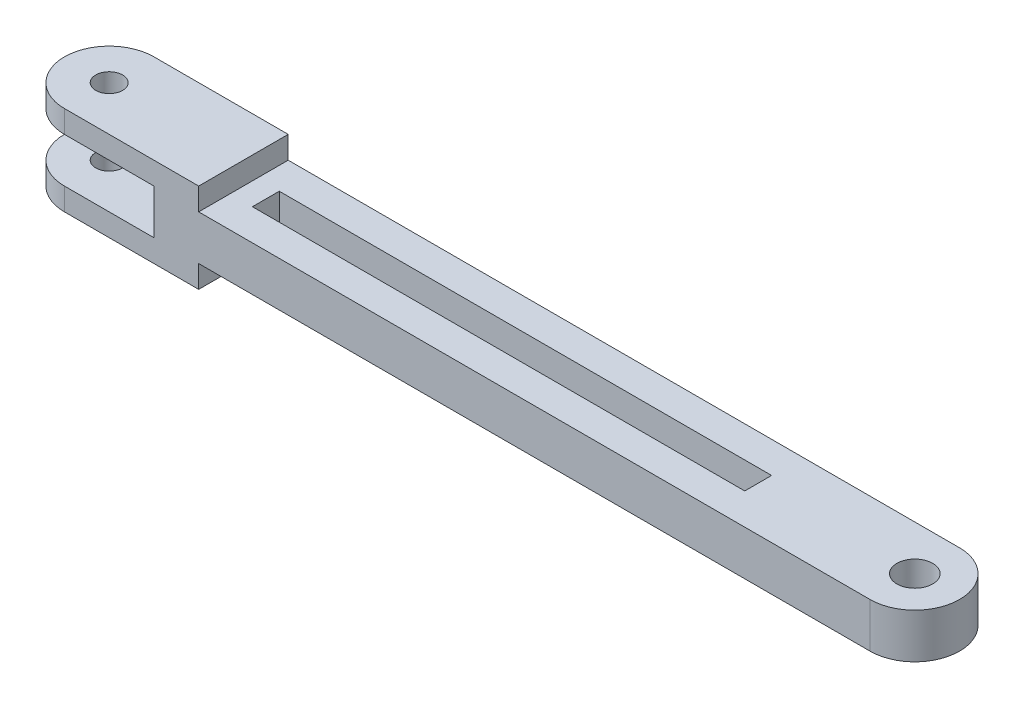
ISO-10303-21;
HEADER;
FILE_DESCRIPTION(('STEP AP214'),'2;1');
FILE_NAME('part.step','',(''),(''),'','','');
FILE_SCHEMA(('AUTOMOTIVE_DESIGN { 1 0 10303 214 1 1 1 1 }'));
ENDSEC;
DATA;
#1=APPLICATION_CONTEXT('core data for automotive mechanical design processes');
#2=APPLICATION_PROTOCOL_DEFINITION('international standard','automotive_design',2000,#1);
#3=PRODUCT_CONTEXT('',#1,'mechanical');
#4=PRODUCT('Part','Part','',(#3));
#5=PRODUCT_RELATED_PRODUCT_CATEGORY('part','',(#4));
#6=PRODUCT_DEFINITION_FORMATION('','',#4);
#7=PRODUCT_DEFINITION_CONTEXT('part definition',#1,'design');
#8=PRODUCT_DEFINITION('design','',#6,#7);
#9=PRODUCT_DEFINITION_SHAPE('','',#8);
#10=(LENGTH_UNIT() NAMED_UNIT(*) SI_UNIT(.MILLI.,.METRE.));
#11=(NAMED_UNIT(*) PLANE_ANGLE_UNIT() SI_UNIT($,.RADIAN.));
#12=(NAMED_UNIT(*) SI_UNIT($,.STERADIAN.) SOLID_ANGLE_UNIT());
#13=UNCERTAINTY_MEASURE_WITH_UNIT(LENGTH_MEASURE(1.E-05),#10,'distance_accuracy_value','');
#14=(GEOMETRIC_REPRESENTATION_CONTEXT(3) GLOBAL_UNCERTAINTY_ASSIGNED_CONTEXT((#13)) GLOBAL_UNIT_ASSIGNED_CONTEXT((#10,
#11,#12)) REPRESENTATION_CONTEXT('',''));
#15=CARTESIAN_POINT('',(0.,0.,0.));
#16=DIRECTION('',(0.,0.,1.));
#17=DIRECTION('',(1.,0.,0.));
#18=AXIS2_PLACEMENT_3D('',#15,#16,#17);
#19=CARTESIAN_POINT('',(0.,0.,10.));
#20=DIRECTION('',(0.,1.,0.));
#21=DIRECTION('',(0.,0.,1.));
#22=AXIS2_PLACEMENT_3D('',#19,#20,#21);
#23=PLANE('',#22);
#24=CARTESIAN_POINT('',(5.,0.,5.));
#25=DIRECTION('',(0.,1.,0.));
#26=DIRECTION('',(0.,0.,1.));
#27=AXIS2_PLACEMENT_3D('',#24,#25,#26);
#28=CIRCLE('',#27,1.5);
#29=CARTESIAN_POINT('',(5.,0.,6.5));
#30=VERTEX_POINT('',#29);
#31=EDGE_CURVE('E247',#30,#30,#28,.T.);
#32=ORIENTED_EDGE('',*,*,#31,.T.);
#33=EDGE_LOOP('',(#32));
#34=FACE_BOUND('',#33,.T.);
#35=DIRECTION('',(1.,0.,0.));
#36=VECTOR('',#35,1.);
#37=CARTESIAN_POINT('',(0.,0.,0.));
#38=LINE('',#37,#36);
#39=CARTESIAN_POINT('',(5.,0.,0.));
#40=VERTEX_POINT('',#39);
#41=CARTESIAN_POINT('',(20.,0.,0.));
#42=VERTEX_POINT('',#41);
#43=EDGE_CURVE('E256',#40,#42,#38,.T.);
#44=ORIENTED_EDGE('',*,*,#43,.T.);
#45=DIRECTION('',(0.,0.,1.));
#46=VECTOR('',#45,1.);
#47=CARTESIAN_POINT('',(20.,0.,10.));
#48=LINE('',#47,#46);
#49=CARTESIAN_POINT('',(20.,0.,10.));
#50=VERTEX_POINT('',#49);
#51=EDGE_CURVE('E181',#42,#50,#48,.T.);
#52=ORIENTED_EDGE('',*,*,#51,.T.);
#53=DIRECTION('',(1.,0.,0.));
#54=VECTOR('',#53,1.);
#55=CARTESIAN_POINT('',(0.,0.,10.));
#56=LINE('',#55,#54);
#57=CARTESIAN_POINT('',(5.,0.,10.));
#58=VERTEX_POINT('',#57);
#59=EDGE_CURVE('E172',#58,#50,#56,.T.);
#60=ORIENTED_EDGE('',*,*,#59,.F.);
#61=CARTESIAN_POINT('',(5.,0.,5.));
#62=DIRECTION('',(0.,-1.,0.));
#63=DIRECTION('',(0.,0.,1.));
#64=AXIS2_PLACEMENT_3D('',#61,#62,#63);
#65=CIRCLE('',#64,5.);
#66=EDGE_CURVE('E222',#58,#40,#65,.T.);
#67=ORIENTED_EDGE('',*,*,#66,.T.);
#68=EDGE_LOOP('',(#44,#52,#60,#67));
#69=FACE_BOUND('',#68,.T.);
#70=ADVANCED_FACE('F33',(#34,#69),#23,.F.);
#71=CARTESIAN_POINT('',(0.,10.,10.));
#72=DIRECTION('',(0.,-1.,0.));
#73=DIRECTION('',(0.,0.,-1.));
#74=AXIS2_PLACEMENT_3D('',#71,#72,#73);
#75=PLANE('',#74);
#76=CARTESIAN_POINT('',(5.,10.,5.));
#77=DIRECTION('',(0.,1.,0.));
#78=DIRECTION('',(0.,0.,1.));
#79=AXIS2_PLACEMENT_3D('',#76,#77,#78);
#80=CIRCLE('',#79,1.5);
#81=CARTESIAN_POINT('',(5.,10.,6.5));
#82=VERTEX_POINT('',#81);
#83=EDGE_CURVE('E242',#82,#82,#80,.T.);
#84=ORIENTED_EDGE('',*,*,#83,.F.);
#85=EDGE_LOOP('',(#84));
#86=FACE_BOUND('',#85,.T.);
#87=DIRECTION('',(-1.,0.,0.));
#88=VECTOR('',#87,1.);
#89=CARTESIAN_POINT('',(0.,10.,10.));
#90=LINE('',#89,#88);
#91=CARTESIAN_POINT('',(20.,10.,10.));
#92=VERTEX_POINT('',#91);
#93=CARTESIAN_POINT('',(5.,10.,10.));
#94=VERTEX_POINT('',#93);
#95=EDGE_CURVE('E258',#92,#94,#90,.T.);
#96=ORIENTED_EDGE('',*,*,#95,.F.);
#97=DIRECTION('',(0.,0.,-1.));
#98=VECTOR('',#97,1.);
#99=CARTESIAN_POINT('',(20.,10.,10.));
#100=LINE('',#99,#98);
#101=CARTESIAN_POINT('',(20.,10.,0.));
#102=VERTEX_POINT('',#101);
#103=EDGE_CURVE('E202',#92,#102,#100,.T.);
#104=ORIENTED_EDGE('',*,*,#103,.T.);
#105=DIRECTION('',(-1.,0.,0.));
#106=VECTOR('',#105,1.);
#107=CARTESIAN_POINT('',(0.,10.,0.));
#108=LINE('',#107,#106);
#109=CARTESIAN_POINT('',(5.,10.,0.));
#110=VERTEX_POINT('',#109);
#111=EDGE_CURVE('E271',#102,#110,#108,.T.);
#112=ORIENTED_EDGE('',*,*,#111,.T.);
#113=CARTESIAN_POINT('',(5.,10.,5.));
#114=DIRECTION('',(0.,-1.,0.));
#115=DIRECTION('',(0.,0.,1.));
#116=AXIS2_PLACEMENT_3D('',#113,#114,#115);
#117=CIRCLE('',#116,5.);
#118=EDGE_CURVE('E221',#94,#110,#117,.T.);
#119=ORIENTED_EDGE('',*,*,#118,.F.);
#120=EDGE_LOOP('',(#96,#104,#112,#119));
#121=FACE_BOUND('',#120,.T.);
#122=ADVANCED_FACE('F315',(#86,#121),#75,.F.);
#123=CARTESIAN_POINT('',(0.,7.50000000000001,10.));
#124=DIRECTION('',(0.,1.,0.));
#125=DIRECTION('',(0.,0.,1.));
#126=AXIS2_PLACEMENT_3D('',#123,#124,#125);
#127=PLANE('',#126);
#128=CARTESIAN_POINT('',(5.,7.50000000000001,5.));
#129=DIRECTION('',(0.,1.,0.));
#130=DIRECTION('',(0.,0.,1.));
#131=AXIS2_PLACEMENT_3D('',#128,#129,#130);
#132=CIRCLE('',#131,1.5);
#133=CARTESIAN_POINT('',(5.,7.50000000000001,6.5));
#134=VERTEX_POINT('',#133);
#135=EDGE_CURVE('E253',#134,#134,#132,.T.);
#136=ORIENTED_EDGE('',*,*,#135,.T.);
#137=EDGE_LOOP('',(#136));
#138=FACE_BOUND('',#137,.T.);
#139=DIRECTION('',(1.,0.,0.));
#140=VECTOR('',#139,1.);
#141=CARTESIAN_POINT('',(0.,7.50000000000001,10.));
#142=LINE('',#141,#140);
#143=CARTESIAN_POINT('',(5.,7.50000000000001,10.));
#144=VERTEX_POINT('',#143);
#145=CARTESIAN_POINT('',(15.,7.50000000000001,10.));
#146=VERTEX_POINT('',#145);
#147=EDGE_CURVE('E261',#144,#146,#142,.T.);
#148=ORIENTED_EDGE('',*,*,#147,.F.);
#149=CARTESIAN_POINT('',(5.,7.50000000000001,5.));
#150=DIRECTION('',(0.,1.,0.));
#151=DIRECTION('',(0.,0.,1.));
#152=AXIS2_PLACEMENT_3D('',#149,#150,#151);
#153=CIRCLE('',#152,5.);
#154=CARTESIAN_POINT('',(5.,7.50000000000001,0.));
#155=VERTEX_POINT('',#154);
#156=EDGE_CURVE('E236',#144,#155,#153,.F.);
#157=ORIENTED_EDGE('',*,*,#156,.T.);
#158=DIRECTION('',(1.,0.,0.));
#159=VECTOR('',#158,1.);
#160=CARTESIAN_POINT('',(0.,7.50000000000001,0.));
#161=LINE('',#160,#159);
#162=CARTESIAN_POINT('',(15.,7.50000000000001,0.));
#163=VERTEX_POINT('',#162);
#164=EDGE_CURVE('E273',#155,#163,#161,.T.);
#165=ORIENTED_EDGE('',*,*,#164,.T.);
#166=DIRECTION('',(0.,0.,-1.));
#167=VECTOR('',#166,1.);
#168=CARTESIAN_POINT('',(15.,7.50000000000001,10.));
#169=LINE('',#168,#167);
#170=EDGE_CURVE('E281',#146,#163,#169,.T.);
#171=ORIENTED_EDGE('',*,*,#170,.F.);
#172=EDGE_LOOP('',(#148,#157,#165,#171));
#173=FACE_BOUND('',#172,.T.);
#174=ADVANCED_FACE('F323',(#138,#173),#127,.F.);
#175=CARTESIAN_POINT('',(15.,7.50000000000001,10.));
#176=DIRECTION('',(1.,0.,0.));
#177=DIRECTION('',(0.,0.,-1.));
#178=AXIS2_PLACEMENT_3D('',#175,#176,#177);
#179=PLANE('',#178);
#180=DIRECTION('',(0.,-1.,0.));
#181=VECTOR('',#180,1.);
#182=CARTESIAN_POINT('',(15.,7.50000000000001,0.));
#183=LINE('',#182,#181);
#184=CARTESIAN_POINT('',(15.,2.50000000000001,0.));
#185=VERTEX_POINT('',#184);
#186=EDGE_CURVE('E275',#163,#185,#183,.T.);
#187=ORIENTED_EDGE('',*,*,#186,.T.);
#188=DIRECTION('',(0.,0.,-1.));
#189=VECTOR('',#188,1.);
#190=CARTESIAN_POINT('',(15.,2.50000000000001,10.));
#191=LINE('',#190,#189);
#192=CARTESIAN_POINT('',(15.,2.50000000000001,10.));
#193=VERTEX_POINT('',#192);
#194=EDGE_CURVE('E268',#193,#185,#191,.T.);
#195=ORIENTED_EDGE('',*,*,#194,.F.);
#196=DIRECTION('',(0.,-1.,0.));
#197=VECTOR('',#196,1.);
#198=CARTESIAN_POINT('',(15.,7.50000000000001,10.));
#199=LINE('',#198,#197);
#200=EDGE_CURVE('E263',#146,#193,#199,.T.);
#201=ORIENTED_EDGE('',*,*,#200,.F.);
#202=ORIENTED_EDGE('',*,*,#170,.T.);
#203=EDGE_LOOP('',(#187,#195,#201,#202));
#204=FACE_BOUND('',#203,.T.);
#205=ADVANCED_FACE('F329',(#204),#179,.F.);
#206=CARTESIAN_POINT('',(0.,2.50000000000001,10.));
#207=DIRECTION('',(0.,-1.,0.));
#208=DIRECTION('',(0.,0.,-1.));
#209=AXIS2_PLACEMENT_3D('',#206,#207,#208);
#210=PLANE('',#209);
#211=CARTESIAN_POINT('',(5.,2.50000000000001,5.));
#212=DIRECTION('',(0.,-1.,0.));
#213=DIRECTION('',(0.,0.,-1.));
#214=AXIS2_PLACEMENT_3D('',#211,#212,#213);
#215=CIRCLE('',#214,1.5);
#216=CARTESIAN_POINT('',(5.,2.50000000000001,3.5));
#217=VERTEX_POINT('',#216);
#218=EDGE_CURVE('E250',#217,#217,#215,.T.);
#219=ORIENTED_EDGE('',*,*,#218,.T.);
#220=EDGE_LOOP('',(#219));
#221=FACE_BOUND('',#220,.T.);
#222=DIRECTION('',(-1.,0.,0.));
#223=VECTOR('',#222,1.);
#224=CARTESIAN_POINT('',(0.,2.50000000000001,0.));
#225=LINE('',#224,#223);
#226=CARTESIAN_POINT('',(5.,2.50000000000001,0.));
#227=VERTEX_POINT('',#226);
#228=EDGE_CURVE('E259',#185,#227,#225,.T.);
#229=ORIENTED_EDGE('',*,*,#228,.T.);
#230=CARTESIAN_POINT('',(5.,2.50000000000001,5.));
#231=DIRECTION('',(0.,-1.,0.));
#232=DIRECTION('',(0.,0.,-1.));
#233=AXIS2_PLACEMENT_3D('',#230,#231,#232);
#234=CIRCLE('',#233,5.);
#235=CARTESIAN_POINT('',(5.,2.50000000000001,10.));
#236=VERTEX_POINT('',#235);
#237=EDGE_CURVE('E231',#227,#236,#234,.F.);
#238=ORIENTED_EDGE('',*,*,#237,.T.);
#239=DIRECTION('',(-1.,0.,0.));
#240=VECTOR('',#239,1.);
#241=CARTESIAN_POINT('',(0.,2.50000000000001,10.));
#242=LINE('',#241,#240);
#243=EDGE_CURVE('E265',#193,#236,#242,.T.);
#244=ORIENTED_EDGE('',*,*,#243,.F.);
#245=ORIENTED_EDGE('',*,*,#194,.T.);
#246=EDGE_LOOP('',(#229,#238,#244,#245));
#247=FACE_BOUND('',#246,.T.);
#248=ADVANCED_FACE('F332',(#221,#247),#210,.F.);
#249=CARTESIAN_POINT('',(0.,0.,10.));
#250=DIRECTION('',(0.,0.,-1.));
#251=DIRECTION('',(-1.,0.,0.));
#252=AXIS2_PLACEMENT_3D('',#249,#250,#251);
#253=PLANE('',#252);
#254=DIRECTION('',(0.,1.,0.));
#255=VECTOR('',#254,1.);
#256=CARTESIAN_POINT('',(20.,2.50000000000002,10.));
#257=LINE('',#256,#255);
#258=CARTESIAN_POINT('',(20.,2.50000000000002,10.));
#259=VERTEX_POINT('',#258);
#260=EDGE_CURVE('E162',#50,#259,#257,.T.);
#261=ORIENTED_EDGE('',*,*,#260,.T.);
#262=DIRECTION('',(-1.,0.,0.));
#263=VECTOR('',#262,1.);
#264=CARTESIAN_POINT('',(90.,2.5,10.));
#265=LINE('',#264,#263);
#266=CARTESIAN_POINT('',(95.,2.5,10.));
#267=VERTEX_POINT('',#266);
#268=EDGE_CURVE('E146',#267,#259,#265,.T.);
#269=ORIENTED_EDGE('',*,*,#268,.F.);
#270=DIRECTION('',(0.,1.,0.));
#271=VECTOR('',#270,1.);
#272=CARTESIAN_POINT('',(95.,2.5,10.));
#273=LINE('',#272,#271);
#274=CARTESIAN_POINT('',(95.,7.5,10.));
#275=VERTEX_POINT('',#274);
#276=EDGE_CURVE('E157',#267,#275,#273,.T.);
#277=ORIENTED_EDGE('',*,*,#276,.T.);
#278=DIRECTION('',(-1.,0.,0.));
#279=VECTOR('',#278,1.);
#280=CARTESIAN_POINT('',(90.,7.5,10.));
#281=LINE('',#280,#279);
#282=CARTESIAN_POINT('',(20.,7.5,10.));
#283=VERTEX_POINT('',#282);
#284=EDGE_CURVE('E216',#275,#283,#281,.T.);
#285=ORIENTED_EDGE('',*,*,#284,.T.);
#286=DIRECTION('',(0.,1.,0.));
#287=VECTOR('',#286,1.);
#288=CARTESIAN_POINT('',(20.,7.5,10.));
#289=LINE('',#288,#287);
#290=EDGE_CURVE('E184',#283,#92,#289,.T.);
#291=ORIENTED_EDGE('',*,*,#290,.T.);
#292=ORIENTED_EDGE('',*,*,#95,.T.);
#293=DIRECTION('',(0.,1.,0.));
#294=VECTOR('',#293,1.);
#295=CARTESIAN_POINT('',(5.,0.,10.));
#296=LINE('',#295,#294);
#297=EDGE_CURVE('E232',#144,#94,#296,.T.);
#298=ORIENTED_EDGE('',*,*,#297,.F.);
#299=ORIENTED_EDGE('',*,*,#147,.T.);
#300=ORIENTED_EDGE('',*,*,#200,.T.);
#301=ORIENTED_EDGE('',*,*,#243,.T.);
#302=EDGE_CURVE('E228',#58,#236,#296,.T.);
#303=ORIENTED_EDGE('',*,*,#302,.F.);
#304=ORIENTED_EDGE('',*,*,#59,.T.);
#305=EDGE_LOOP('',(#261,#269,#277,#285,#291,#292,#298,#299,#300,#301,#303,#304));
#306=FACE_BOUND('',#305,.T.);
#307=ADVANCED_FACE('F169',(#306),#253,.F.);
#308=CARTESIAN_POINT('',(0.,0.,0.));
#309=DIRECTION('',(0.,0.,-1.));
#310=DIRECTION('',(-1.,0.,0.));
#311=AXIS2_PLACEMENT_3D('',#308,#309,#310);
#312=PLANE('',#311);
#313=DIRECTION('',(1.,0.,0.));
#314=VECTOR('',#313,1.);
#315=CARTESIAN_POINT('',(90.,2.5,0.));
#316=LINE('',#315,#314);
#317=CARTESIAN_POINT('',(20.,2.50000000000002,0.));
#318=VERTEX_POINT('',#317);
#319=CARTESIAN_POINT('',(95.,2.5,0.));
#320=VERTEX_POINT('',#319);
#321=EDGE_CURVE('E213',#318,#320,#316,.T.);
#322=ORIENTED_EDGE('',*,*,#321,.F.);
#323=DIRECTION('',(0.,1.,0.));
#324=VECTOR('',#323,1.);
#325=CARTESIAN_POINT('',(20.,2.50000000000002,0.));
#326=LINE('',#325,#324);
#327=EDGE_CURVE('E165',#42,#318,#326,.T.);
#328=ORIENTED_EDGE('',*,*,#327,.F.);
#329=ORIENTED_EDGE('',*,*,#43,.F.);
#330=DIRECTION('',(0.,1.,0.));
#331=VECTOR('',#330,1.);
#332=CARTESIAN_POINT('',(5.,0.,0.));
#333=LINE('',#332,#331);
#334=EDGE_CURVE('E225',#40,#227,#333,.T.);
#335=ORIENTED_EDGE('',*,*,#334,.T.);
#336=ORIENTED_EDGE('',*,*,#228,.F.);
#337=ORIENTED_EDGE('',*,*,#186,.F.);
#338=ORIENTED_EDGE('',*,*,#164,.F.);
#339=DIRECTION('',(0.,1.,0.));
#340=VECTOR('',#339,1.);
#341=CARTESIAN_POINT('',(5.,0.,0.));
#342=LINE('',#341,#340);
#343=EDGE_CURVE('E40',#110,#155,#342,.F.);
#344=ORIENTED_EDGE('',*,*,#343,.F.);
#345=ORIENTED_EDGE('',*,*,#111,.F.);
#346=DIRECTION('',(0.,1.,0.));
#347=VECTOR('',#346,1.);
#348=CARTESIAN_POINT('',(20.,7.5,0.));
#349=LINE('',#348,#347);
#350=CARTESIAN_POINT('',(20.,7.5,0.));
#351=VERTEX_POINT('',#350);
#352=EDGE_CURVE('E183',#351,#102,#349,.T.);
#353=ORIENTED_EDGE('',*,*,#352,.F.);
#354=DIRECTION('',(1.,0.,0.));
#355=VECTOR('',#354,1.);
#356=CARTESIAN_POINT('',(90.,7.5,0.));
#357=LINE('',#356,#355);
#358=CARTESIAN_POINT('',(95.,7.5,0.));
#359=VERTEX_POINT('',#358);
#360=EDGE_CURVE('E209',#351,#359,#357,.T.);
#361=ORIENTED_EDGE('',*,*,#360,.T.);
#362=DIRECTION('',(0.,1.,0.));
#363=VECTOR('',#362,1.);
#364=CARTESIAN_POINT('',(95.,2.5,0.));
#365=LINE('',#364,#363);
#366=EDGE_CURVE('E218',#320,#359,#365,.T.);
#367=ORIENTED_EDGE('',*,*,#366,.F.);
#368=EDGE_LOOP('',(#322,#328,#329,#335,#336,#337,#338,#344,#345,#353,#361,#367));
#369=FACE_BOUND('',#368,.T.);
#370=ADVANCED_FACE('F299',(#369),#312,.T.);
#371=CARTESIAN_POINT('',(5.,0.,5.));
#372=DIRECTION('',(0.,1.,0.));
#373=DIRECTION('',(0.,0.,1.));
#374=AXIS2_PLACEMENT_3D('',#371,#372,#373);
#375=CYLINDRICAL_SURFACE('',#374,1.5);
#376=ORIENTED_EDGE('',*,*,#31,.F.);
#377=EDGE_LOOP('',(#376));
#378=FACE_BOUND('',#377,.T.);
#379=ORIENTED_EDGE('',*,*,#218,.F.);
#380=EDGE_LOOP('',(#379));
#381=FACE_BOUND('',#380,.T.);
#382=ADVANCED_FACE('F346',(#378,#381),#375,.F.);
#383=ORIENTED_EDGE('',*,*,#83,.T.);
#384=EDGE_LOOP('',(#383));
#385=FACE_BOUND('',#384,.T.);
#386=ORIENTED_EDGE('',*,*,#135,.F.);
#387=EDGE_LOOP('',(#386));
#388=FACE_BOUND('',#387,.T.);
#389=ADVANCED_FACE('F349',(#385,#388),#375,.F.);
#390=CARTESIAN_POINT('',(77.5,0.,6.5));
#391=DIRECTION('',(1.,0.,0.));
#392=DIRECTION('',(0.,0.,-1.));
#393=AXIS2_PLACEMENT_3D('',#390,#391,#392);
#394=PLANE('',#393);
#395=DIRECTION('',(0.,1.,0.));
#396=VECTOR('',#395,1.);
#397=CARTESIAN_POINT('',(77.5,0.,3.5));
#398=LINE('',#397,#396);
#399=CARTESIAN_POINT('',(77.5,2.50000000000001,3.5));
#400=VERTEX_POINT('',#399);
#401=CARTESIAN_POINT('',(77.5,7.5,3.5));
#402=VERTEX_POINT('',#401);
#403=EDGE_CURVE('E239',#400,#402,#398,.T.);
#404=ORIENTED_EDGE('',*,*,#403,.F.);
#405=DIRECTION('',(0.,0.,1.));
#406=VECTOR('',#405,1.);
#407=CARTESIAN_POINT('',(77.5,2.5,6.5));
#408=LINE('',#407,#406);
#409=CARTESIAN_POINT('',(77.5,2.5,6.5));
#410=VERTEX_POINT('',#409);
#411=EDGE_CURVE('E47',#400,#410,#408,.T.);
#412=ORIENTED_EDGE('',*,*,#411,.T.);
#413=DIRECTION('',(0.,1.,0.));
#414=VECTOR('',#413,1.);
#415=CARTESIAN_POINT('',(77.5,0.,6.5));
#416=LINE('',#415,#414);
#417=CARTESIAN_POINT('',(77.5,7.5,6.5));
#418=VERTEX_POINT('',#417);
#419=EDGE_CURVE('E240',#410,#418,#416,.T.);
#420=ORIENTED_EDGE('',*,*,#419,.T.);
#421=DIRECTION('',(0.,0.,-1.));
#422=VECTOR('',#421,1.);
#423=CARTESIAN_POINT('',(77.5,7.5,6.5));
#424=LINE('',#423,#422);
#425=EDGE_CURVE('E199',#418,#402,#424,.T.);
#426=ORIENTED_EDGE('',*,*,#425,.T.);
#427=EDGE_LOOP('',(#404,#412,#420,#426));
#428=FACE_BOUND('',#427,.T.);
#429=ADVANCED_FACE('F370',(#428),#394,.F.);
#430=CARTESIAN_POINT('',(22.5,0.,6.5));
#431=DIRECTION('',(0.,0.,1.));
#432=DIRECTION('',(1.,0.,0.));
#433=AXIS2_PLACEMENT_3D('',#430,#431,#432);
#434=PLANE('',#433);
#435=ORIENTED_EDGE('',*,*,#419,.F.);
#436=DIRECTION('',(-1.,0.,0.));
#437=VECTOR('',#436,1.);
#438=CARTESIAN_POINT('',(22.5,2.50000000000002,6.5));
#439=LINE('',#438,#437);
#440=CARTESIAN_POINT('',(22.5,2.50000000000002,6.5));
#441=VERTEX_POINT('',#440);
#442=EDGE_CURVE('E177',#410,#441,#439,.T.);
#443=ORIENTED_EDGE('',*,*,#442,.T.);
#444=DIRECTION('',(0.,1.,0.));
#445=VECTOR('',#444,1.);
#446=CARTESIAN_POINT('',(22.5,0.,6.5));
#447=LINE('',#446,#445);
#448=CARTESIAN_POINT('',(22.5,7.5,6.5));
#449=VERTEX_POINT('',#448);
#450=EDGE_CURVE('E243',#441,#449,#447,.T.);
#451=ORIENTED_EDGE('',*,*,#450,.T.);
#452=DIRECTION('',(1.,0.,0.));
#453=VECTOR('',#452,1.);
#454=CARTESIAN_POINT('',(22.5,7.5,6.5));
#455=LINE('',#454,#453);
#456=EDGE_CURVE('E196',#449,#418,#455,.T.);
#457=ORIENTED_EDGE('',*,*,#456,.T.);
#458=EDGE_LOOP('',(#435,#443,#451,#457));
#459=FACE_BOUND('',#458,.T.);
#460=ADVANCED_FACE('F375',(#459),#434,.F.);
#461=CARTESIAN_POINT('',(22.5,0.,6.5));
#462=DIRECTION('',(-1.,0.,0.));
#463=DIRECTION('',(0.,0.,1.));
#464=AXIS2_PLACEMENT_3D('',#461,#462,#463);
#465=PLANE('',#464);
#466=ORIENTED_EDGE('',*,*,#450,.F.);
#467=DIRECTION('',(0.,0.,-1.));
#468=VECTOR('',#467,1.);
#469=CARTESIAN_POINT('',(22.5,2.50000000000002,6.5));
#470=LINE('',#469,#468);
#471=CARTESIAN_POINT('',(22.5,2.50000000000002,3.5));
#472=VERTEX_POINT('',#471);
#473=EDGE_CURVE('E166',#441,#472,#470,.T.);
#474=ORIENTED_EDGE('',*,*,#473,.T.);
#475=DIRECTION('',(0.,1.,0.));
#476=VECTOR('',#475,1.);
#477=CARTESIAN_POINT('',(22.5,0.,3.5));
#478=LINE('',#477,#476);
#479=CARTESIAN_POINT('',(22.5,7.5,3.5));
#480=VERTEX_POINT('',#479);
#481=EDGE_CURVE('E54',#472,#480,#478,.T.);
#482=ORIENTED_EDGE('',*,*,#481,.T.);
#483=DIRECTION('',(0.,0.,1.));
#484=VECTOR('',#483,1.);
#485=CARTESIAN_POINT('',(22.5,7.5,6.5));
#486=LINE('',#485,#484);
#487=EDGE_CURVE('E194',#480,#449,#486,.T.);
#488=ORIENTED_EDGE('',*,*,#487,.T.);
#489=EDGE_LOOP('',(#466,#474,#482,#488));
#490=FACE_BOUND('',#489,.T.);
#491=ADVANCED_FACE('F382',(#490),#465,.F.);
#492=CARTESIAN_POINT('',(22.5,0.,3.5));
#493=DIRECTION('',(0.,0.,-1.));
#494=DIRECTION('',(-1.,0.,0.));
#495=AXIS2_PLACEMENT_3D('',#492,#493,#494);
#496=PLANE('',#495);
#497=ORIENTED_EDGE('',*,*,#481,.F.);
#498=DIRECTION('',(1.,0.,0.));
#499=VECTOR('',#498,1.);
#500=CARTESIAN_POINT('',(22.5,2.50000000000002,3.5));
#501=LINE('',#500,#499);
#502=EDGE_CURVE('E11',#472,#400,#501,.T.);
#503=ORIENTED_EDGE('',*,*,#502,.T.);
#504=ORIENTED_EDGE('',*,*,#403,.T.);
#505=DIRECTION('',(-1.,0.,0.));
#506=VECTOR('',#505,1.);
#507=CARTESIAN_POINT('',(22.5,7.5,3.5));
#508=LINE('',#507,#506);
#509=EDGE_CURVE('E191',#402,#480,#508,.T.);
#510=ORIENTED_EDGE('',*,*,#509,.T.);
#511=EDGE_LOOP('',(#497,#503,#504,#510));
#512=FACE_BOUND('',#511,.T.);
#513=ADVANCED_FACE('F379',(#512),#496,.F.);
#514=CARTESIAN_POINT('',(5.,0.,5.));
#515=DIRECTION('',(0.,1.,0.));
#516=DIRECTION('',(0.,0.,1.));
#517=AXIS2_PLACEMENT_3D('',#514,#515,#516);
#518=CYLINDRICAL_SURFACE('',#517,5.);
#519=ORIENTED_EDGE('',*,*,#237,.F.);
#520=ORIENTED_EDGE('',*,*,#334,.F.);
#521=ORIENTED_EDGE('',*,*,#66,.F.);
#522=ORIENTED_EDGE('',*,*,#302,.T.);
#523=EDGE_LOOP('',(#519,#520,#521,#522));
#524=FACE_BOUND('',#523,.T.);
#525=ADVANCED_FACE('F335',(#524),#518,.T.);
#526=ORIENTED_EDGE('',*,*,#118,.T.);
#527=ORIENTED_EDGE('',*,*,#343,.T.);
#528=ORIENTED_EDGE('',*,*,#156,.F.);
#529=ORIENTED_EDGE('',*,*,#297,.T.);
#530=EDGE_LOOP('',(#526,#527,#528,#529));
#531=FACE_BOUND('',#530,.T.);
#532=ADVANCED_FACE('F319',(#531),#518,.T.);
#533=CARTESIAN_POINT('',(95.,2.5,5.));
#534=DIRECTION('',(0.,-1.,0.));
#535=DIRECTION('',(0.,0.,-1.));
#536=AXIS2_PLACEMENT_3D('',#533,#534,#535);
#537=PLANE('',#536);
#538=ORIENTED_EDGE('',*,*,#268,.T.);
#539=DIRECTION('',(0.,0.,-1.));
#540=VECTOR('',#539,1.);
#541=CARTESIAN_POINT('',(20.,2.50000000000002,10.));
#542=LINE('',#541,#540);
#543=EDGE_CURVE('E150',#259,#318,#542,.T.);
#544=ORIENTED_EDGE('',*,*,#543,.T.);
#545=ORIENTED_EDGE('',*,*,#321,.T.);
#546=CARTESIAN_POINT('',(95.,2.5,5.));
#547=DIRECTION('',(0.,-1.,0.));
#548=DIRECTION('',(0.,0.,-1.));
#549=AXIS2_PLACEMENT_3D('',#546,#547,#548);
#550=CIRCLE('',#549,5.);
#551=EDGE_CURVE('E152',#320,#267,#550,.T.);
#552=ORIENTED_EDGE('',*,*,#551,.T.);
#553=EDGE_LOOP('',(#538,#544,#545,#552));
#554=FACE_BOUND('',#553,.T.);
#555=CARTESIAN_POINT('',(95.,2.5,5.));
#556=DIRECTION('',(0.,-1.,0.));
#557=DIRECTION('',(0.,0.,-1.));
#558=AXIS2_PLACEMENT_3D('',#555,#556,#557);
#559=CIRCLE('',#558,2.);
#560=CARTESIAN_POINT('',(95.,2.5,3.));
#561=VERTEX_POINT('',#560);
#562=EDGE_CURVE('E206',#561,#561,#559,.T.);
#563=ORIENTED_EDGE('',*,*,#562,.F.);
#564=EDGE_LOOP('',(#563));
#565=FACE_BOUND('',#564,.T.);
#566=ORIENTED_EDGE('',*,*,#502,.F.);
#567=ORIENTED_EDGE('',*,*,#473,.F.);
#568=ORIENTED_EDGE('',*,*,#442,.F.);
#569=ORIENTED_EDGE('',*,*,#411,.F.);
#570=EDGE_LOOP('',(#566,#567,#568,#569));
#571=FACE_BOUND('',#570,.T.);
#572=ADVANCED_FACE('F148',(#554,#565,#571),#537,.T.);
#573=CARTESIAN_POINT('',(95.,7.5,5.));
#574=DIRECTION('',(0.,-1.,0.));
#575=DIRECTION('',(0.,0.,-1.));
#576=AXIS2_PLACEMENT_3D('',#573,#574,#575);
#577=PLANE('',#576);
#578=ORIENTED_EDGE('',*,*,#360,.F.);
#579=DIRECTION('',(0.,0.,-1.));
#580=VECTOR('',#579,1.);
#581=CARTESIAN_POINT('',(20.,7.5,10.));
#582=LINE('',#581,#580);
#583=EDGE_CURVE('E187',#283,#351,#582,.T.);
#584=ORIENTED_EDGE('',*,*,#583,.F.);
#585=ORIENTED_EDGE('',*,*,#284,.F.);
#586=CARTESIAN_POINT('',(95.,7.5,5.));
#587=DIRECTION('',(0.,-1.,0.));
#588=DIRECTION('',(0.,0.,-1.));
#589=AXIS2_PLACEMENT_3D('',#586,#587,#588);
#590=CIRCLE('',#589,5.);
#591=EDGE_CURVE('E214',#359,#275,#590,.T.);
#592=ORIENTED_EDGE('',*,*,#591,.F.);
#593=EDGE_LOOP('',(#578,#584,#585,#592));
#594=FACE_BOUND('',#593,.T.);
#595=CARTESIAN_POINT('',(95.,7.5,5.));
#596=DIRECTION('',(0.,-1.,0.));
#597=DIRECTION('',(0.,0.,-1.));
#598=AXIS2_PLACEMENT_3D('',#595,#596,#597);
#599=CIRCLE('',#598,2.);
#600=CARTESIAN_POINT('',(95.,7.5,3.));
#601=VERTEX_POINT('',#600);
#602=EDGE_CURVE('E205',#601,#601,#599,.T.);
#603=ORIENTED_EDGE('',*,*,#602,.T.);
#604=EDGE_LOOP('',(#603));
#605=FACE_BOUND('',#604,.T.);
#606=ORIENTED_EDGE('',*,*,#456,.F.);
#607=ORIENTED_EDGE('',*,*,#487,.F.);
#608=ORIENTED_EDGE('',*,*,#509,.F.);
#609=ORIENTED_EDGE('',*,*,#425,.F.);
#610=EDGE_LOOP('',(#606,#607,#608,#609));
#611=FACE_BOUND('',#610,.T.);
#612=ADVANCED_FACE('F307',(#594,#605,#611),#577,.F.);
#613=CARTESIAN_POINT('',(95.,2.5,5.));
#614=DIRECTION('',(0.,1.,0.));
#615=DIRECTION('',(0.,0.,1.));
#616=AXIS2_PLACEMENT_3D('',#613,#614,#615);
#617=CYLINDRICAL_SURFACE('',#616,5.);
#618=ORIENTED_EDGE('',*,*,#591,.T.);
#619=ORIENTED_EDGE('',*,*,#276,.F.);
#620=ORIENTED_EDGE('',*,*,#551,.F.);
#621=ORIENTED_EDGE('',*,*,#366,.T.);
#622=EDGE_LOOP('',(#618,#619,#620,#621));
#623=FACE_BOUND('',#622,.T.);
#624=ADVANCED_FACE('F305',(#623),#617,.T.);
#625=CARTESIAN_POINT('',(95.,2.5,5.));
#626=DIRECTION('',(0.,1.,0.));
#627=DIRECTION('',(0.,0.,1.));
#628=AXIS2_PLACEMENT_3D('',#625,#626,#627);
#629=CYLINDRICAL_SURFACE('',#628,2.);
#630=ORIENTED_EDGE('',*,*,#562,.T.);
#631=EDGE_LOOP('',(#630));
#632=FACE_BOUND('',#631,.T.);
#633=ORIENTED_EDGE('',*,*,#602,.F.);
#634=EDGE_LOOP('',(#633));
#635=FACE_BOUND('',#634,.T.);
#636=ADVANCED_FACE('F393',(#632,#635),#629,.F.);
#637=CARTESIAN_POINT('',(20.,7.5,10.));
#638=DIRECTION('',(-1.,0.,0.));
#639=DIRECTION('',(0.,0.,1.));
#640=AXIS2_PLACEMENT_3D('',#637,#638,#639);
#641=PLANE('',#640);
#642=ORIENTED_EDGE('',*,*,#290,.F.);
#643=ORIENTED_EDGE('',*,*,#583,.T.);
#644=ORIENTED_EDGE('',*,*,#352,.T.);
#645=ORIENTED_EDGE('',*,*,#103,.F.);
#646=EDGE_LOOP('',(#642,#643,#644,#645));
#647=FACE_BOUND('',#646,.T.);
#648=ADVANCED_FACE('F400',(#647),#641,.F.);
#649=CARTESIAN_POINT('',(20.,2.50000000000002,10.));
#650=DIRECTION('',(-1.,0.,0.));
#651=DIRECTION('',(0.,-1.,0.));
#652=AXIS2_PLACEMENT_3D('',#649,#650,#651);
#653=PLANE('',#652);
#654=ORIENTED_EDGE('',*,*,#327,.T.);
#655=ORIENTED_EDGE('',*,*,#543,.F.);
#656=ORIENTED_EDGE('',*,*,#260,.F.);
#657=ORIENTED_EDGE('',*,*,#51,.F.);
#658=EDGE_LOOP('',(#654,#655,#656,#657));
#659=FACE_BOUND('',#658,.T.);
#660=ADVANCED_FACE('F161',(#659),#653,.F.);
#661=CLOSED_SHELL('',(#70,#122,#174,#205,#248,#307,#370,#382,#389,#429,#460,#491,#513,#525,#532,
#572,#612,#624,#636,#648,#660));
#662=MANIFOLD_SOLID_BREP('B2',#661);
#663=ADVANCED_BREP_SHAPE_REPRESENTATION('',(#18,#662),#14);
#664=SHAPE_DEFINITION_REPRESENTATION(#9,#663);
ENDSEC;
END-ISO-10303-21;
